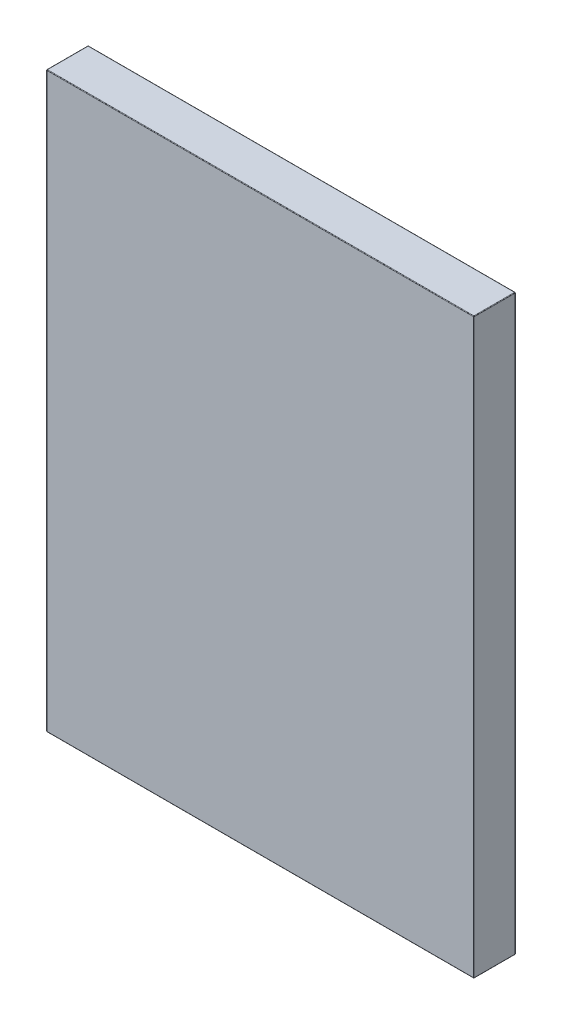
ISO-10303-21;
HEADER;
FILE_DESCRIPTION(('STEP AP214'),'2;1');
FILE_NAME('part.step','',(''),(''),'','','');
FILE_SCHEMA(('AUTOMOTIVE_DESIGN { 1 0 10303 214 1 1 1 1 }'));
ENDSEC;
DATA;
#1=APPLICATION_CONTEXT('core data for automotive mechanical design processes');
#2=APPLICATION_PROTOCOL_DEFINITION('international standard','automotive_design',2000,#1);
#3=PRODUCT_CONTEXT('',#1,'mechanical');
#4=PRODUCT('Part','Part','',(#3));
#5=PRODUCT_RELATED_PRODUCT_CATEGORY('part','',(#4));
#6=PRODUCT_DEFINITION_FORMATION('','',#4);
#7=PRODUCT_DEFINITION_CONTEXT('part definition',#1,'design');
#8=PRODUCT_DEFINITION('design','',#6,#7);
#9=PRODUCT_DEFINITION_SHAPE('','',#8);
#10=(LENGTH_UNIT() NAMED_UNIT(*) SI_UNIT(.MILLI.,.METRE.));
#11=(NAMED_UNIT(*) PLANE_ANGLE_UNIT() SI_UNIT($,.RADIAN.));
#12=(NAMED_UNIT(*) SI_UNIT($,.STERADIAN.) SOLID_ANGLE_UNIT());
#13=UNCERTAINTY_MEASURE_WITH_UNIT(LENGTH_MEASURE(1.E-05),#10,'distance_accuracy_value','');
#14=(GEOMETRIC_REPRESENTATION_CONTEXT(3) GLOBAL_UNCERTAINTY_ASSIGNED_CONTEXT((#13)) GLOBAL_UNIT_ASSIGNED_CONTEXT((#10,
#11,#12)) REPRESENTATION_CONTEXT('',''));
#15=CARTESIAN_POINT('',(0.,0.,0.));
#16=DIRECTION('',(0.,0.,1.));
#17=DIRECTION('',(1.,0.,0.));
#18=AXIS2_PLACEMENT_3D('',#15,#16,#17);
#19=CARTESIAN_POINT('',(410.,550.,80.));
#20=DIRECTION('',(-1.,0.,0.));
#21=DIRECTION('',(0.,-1.,0.));
#22=AXIS2_PLACEMENT_3D('',#19,#20,#21);
#23=PLANE('',#22);
#24=DIRECTION('',(0.,1.,0.));
#25=VECTOR('',#24,1.);
#26=CARTESIAN_POINT('',(410.,-550.,79.));
#27=LINE('',#26,#25);
#28=CARTESIAN_POINT('',(410.,549.,79.));
#29=VERTEX_POINT('',#28);
#30=CARTESIAN_POINT('',(410.,-549.,79.));
#31=VERTEX_POINT('',#30);
#32=EDGE_CURVE('E179',#29,#31,#27,.F.);
#33=ORIENTED_EDGE('',*,*,#32,.T.);
#34=DIRECTION('',(0.,0.,-1.));
#35=VECTOR('',#34,1.);
#36=CARTESIAN_POINT('',(410.,-549.,80.));
#37=LINE('',#36,#35);
#38=CARTESIAN_POINT('',(410.,-549.,1.));
#39=VERTEX_POINT('',#38);
#40=EDGE_CURVE('E183',#31,#39,#37,.T.);
#41=ORIENTED_EDGE('',*,*,#40,.T.);
#42=DIRECTION('',(0.,1.,0.));
#43=VECTOR('',#42,1.);
#44=CARTESIAN_POINT('',(410.,550.,1.));
#45=LINE('',#44,#43);
#46=CARTESIAN_POINT('',(410.,549.,1.));
#47=VERTEX_POINT('',#46);
#48=EDGE_CURVE('E164',#39,#47,#45,.T.);
#49=ORIENTED_EDGE('',*,*,#48,.T.);
#50=DIRECTION('',(0.,0.,-1.));
#51=VECTOR('',#50,1.);
#52=CARTESIAN_POINT('',(410.,549.,80.));
#53=LINE('',#52,#51);
#54=EDGE_CURVE('E181',#47,#29,#53,.F.);
#55=ORIENTED_EDGE('',*,*,#54,.T.);
#56=EDGE_LOOP('',(#33,#41,#49,#55));
#57=FACE_BOUND('',#56,.T.);
#58=ADVANCED_FACE('F35',(#57),#23,.F.);
#59=CARTESIAN_POINT('',(-410.,550.,80.));
#60=DIRECTION('',(0.,-1.,0.));
#61=DIRECTION('',(0.,0.,-1.));
#62=AXIS2_PLACEMENT_3D('',#59,#60,#61);
#63=PLANE('',#62);
#64=DIRECTION('',(-1.,0.,0.));
#65=VECTOR('',#64,1.);
#66=CARTESIAN_POINT('',(-410.,550.,1.));
#67=LINE('',#66,#65);
#68=CARTESIAN_POINT('',(409.,550.,1.));
#69=VERTEX_POINT('',#68);
#70=CARTESIAN_POINT('',(-409.,550.,1.));
#71=VERTEX_POINT('',#70);
#72=EDGE_CURVE('E132',#69,#71,#67,.T.);
#73=ORIENTED_EDGE('',*,*,#72,.T.);
#74=DIRECTION('',(0.,0.,-1.));
#75=VECTOR('',#74,1.);
#76=CARTESIAN_POINT('',(-409.,550.,80.));
#77=LINE('',#76,#75);
#78=CARTESIAN_POINT('',(-409.,550.,79.));
#79=VERTEX_POINT('',#78);
#80=EDGE_CURVE('E201',#71,#79,#77,.F.);
#81=ORIENTED_EDGE('',*,*,#80,.T.);
#82=DIRECTION('',(-1.,0.,0.));
#83=VECTOR('',#82,1.);
#84=CARTESIAN_POINT('',(410.,550.,79.));
#85=LINE('',#84,#83);
#86=CARTESIAN_POINT('',(409.,550.,79.));
#87=VERTEX_POINT('',#86);
#88=EDGE_CURVE('E197',#79,#87,#85,.F.);
#89=ORIENTED_EDGE('',*,*,#88,.T.);
#90=DIRECTION('',(0.,0.,-1.));
#91=VECTOR('',#90,1.);
#92=CARTESIAN_POINT('',(409.,550.,80.));
#93=LINE('',#92,#91);
#94=EDGE_CURVE('E199',#87,#69,#93,.T.);
#95=ORIENTED_EDGE('',*,*,#94,.T.);
#96=EDGE_LOOP('',(#73,#81,#89,#95));
#97=FACE_BOUND('',#96,.T.);
#98=ADVANCED_FACE('F302',(#97),#63,.F.);
#99=CARTESIAN_POINT('',(-410.,550.,80.));
#100=DIRECTION('',(1.,0.,0.));
#101=DIRECTION('',(0.,1.,0.));
#102=AXIS2_PLACEMENT_3D('',#99,#100,#101);
#103=PLANE('',#102);
#104=DIRECTION('',(0.,-1.,0.));
#105=VECTOR('',#104,1.);
#106=CARTESIAN_POINT('',(-410.,550.,1.));
#107=LINE('',#106,#105);
#108=CARTESIAN_POINT('',(-410.,549.,1.));
#109=VERTEX_POINT('',#108);
#110=CARTESIAN_POINT('',(-410.,-549.,1.));
#111=VERTEX_POINT('',#110);
#112=EDGE_CURVE('E159',#109,#111,#107,.T.);
#113=ORIENTED_EDGE('',*,*,#112,.T.);
#114=DIRECTION('',(0.,0.,-1.));
#115=VECTOR('',#114,1.);
#116=CARTESIAN_POINT('',(-410.,-549.,80.));
#117=LINE('',#116,#115);
#118=CARTESIAN_POINT('',(-410.,-549.,79.));
#119=VERTEX_POINT('',#118);
#120=EDGE_CURVE('E195',#111,#119,#117,.F.);
#121=ORIENTED_EDGE('',*,*,#120,.T.);
#122=DIRECTION('',(0.,-1.,0.));
#123=VECTOR('',#122,1.);
#124=CARTESIAN_POINT('',(-410.,550.,79.));
#125=LINE('',#124,#123);
#126=CARTESIAN_POINT('',(-410.,549.,79.));
#127=VERTEX_POINT('',#126);
#128=EDGE_CURVE('E191',#119,#127,#125,.F.);
#129=ORIENTED_EDGE('',*,*,#128,.T.);
#130=DIRECTION('',(0.,0.,-1.));
#131=VECTOR('',#130,1.);
#132=CARTESIAN_POINT('',(-410.,549.,80.));
#133=LINE('',#132,#131);
#134=EDGE_CURVE('E193',#127,#109,#133,.T.);
#135=ORIENTED_EDGE('',*,*,#134,.T.);
#136=EDGE_LOOP('',(#113,#121,#129,#135));
#137=FACE_BOUND('',#136,.T.);
#138=ADVANCED_FACE('F292',(#137),#103,.F.);
#139=CARTESIAN_POINT('',(-410.,-550.,80.));
#140=DIRECTION('',(0.,1.,0.));
#141=DIRECTION('',(0.,0.,1.));
#142=AXIS2_PLACEMENT_3D('',#139,#140,#141);
#143=PLANE('',#142);
#144=DIRECTION('',(1.,0.,0.));
#145=VECTOR('',#144,1.);
#146=CARTESIAN_POINT('',(-410.,-550.,1.));
#147=LINE('',#146,#145);
#148=CARTESIAN_POINT('',(-409.,-550.,1.));
#149=VERTEX_POINT('',#148);
#150=CARTESIAN_POINT('',(409.,-550.,1.));
#151=VERTEX_POINT('',#150);
#152=EDGE_CURVE('E168',#149,#151,#147,.T.);
#153=ORIENTED_EDGE('',*,*,#152,.T.);
#154=DIRECTION('',(0.,0.,-1.));
#155=VECTOR('',#154,1.);
#156=CARTESIAN_POINT('',(409.,-550.,80.));
#157=LINE('',#156,#155);
#158=CARTESIAN_POINT('',(409.,-550.,79.));
#159=VERTEX_POINT('',#158);
#160=EDGE_CURVE('E189',#151,#159,#157,.F.);
#161=ORIENTED_EDGE('',*,*,#160,.T.);
#162=DIRECTION('',(1.,0.,0.));
#163=VECTOR('',#162,1.);
#164=CARTESIAN_POINT('',(-410.,-550.,79.));
#165=LINE('',#164,#163);
#166=CARTESIAN_POINT('',(-409.,-550.,79.));
#167=VERTEX_POINT('',#166);
#168=EDGE_CURVE('E185',#159,#167,#165,.F.);
#169=ORIENTED_EDGE('',*,*,#168,.T.);
#170=DIRECTION('',(0.,0.,-1.));
#171=VECTOR('',#170,1.);
#172=CARTESIAN_POINT('',(-409.,-550.,80.));
#173=LINE('',#172,#171);
#174=EDGE_CURVE('E187',#167,#149,#173,.T.);
#175=ORIENTED_EDGE('',*,*,#174,.T.);
#176=EDGE_LOOP('',(#153,#161,#169,#175));
#177=FACE_BOUND('',#176,.T.);
#178=ADVANCED_FACE('F265',(#177),#143,.F.);
#179=CARTESIAN_POINT('',(0.,0.,80.));
#180=DIRECTION('',(0.,0.,1.));
#181=DIRECTION('',(1.,0.,0.));
#182=AXIS2_PLACEMENT_3D('',#179,#180,#181);
#183=PLANE('',#182);
#184=DIRECTION('',(0.,-1.,0.));
#185=VECTOR('',#184,1.);
#186=CARTESIAN_POINT('',(-409.,-550.,80.));
#187=LINE('',#186,#185);
#188=CARTESIAN_POINT('',(-409.,549.,80.));
#189=VERTEX_POINT('',#188);
#190=CARTESIAN_POINT('',(-409.,-549.,80.));
#191=VERTEX_POINT('',#190);
#192=EDGE_CURVE('E44',#189,#191,#187,.T.);
#193=ORIENTED_EDGE('',*,*,#192,.T.);
#194=DIRECTION('',(1.,0.,0.));
#195=VECTOR('',#194,1.);
#196=CARTESIAN_POINT('',(410.,-549.,80.));
#197=LINE('',#196,#195);
#198=CARTESIAN_POINT('',(409.,-549.,80.));
#199=VERTEX_POINT('',#198);
#200=EDGE_CURVE('E11',#191,#199,#197,.T.);
#201=ORIENTED_EDGE('',*,*,#200,.T.);
#202=DIRECTION('',(0.,1.,0.));
#203=VECTOR('',#202,1.);
#204=CARTESIAN_POINT('',(409.,550.,80.));
#205=LINE('',#204,#203);
#206=CARTESIAN_POINT('',(409.,549.,80.));
#207=VERTEX_POINT('',#206);
#208=EDGE_CURVE('E203',#199,#207,#205,.T.);
#209=ORIENTED_EDGE('',*,*,#208,.T.);
#210=DIRECTION('',(-1.,0.,0.));
#211=VECTOR('',#210,1.);
#212=CARTESIAN_POINT('',(-410.,549.,80.));
#213=LINE('',#212,#211);
#214=EDGE_CURVE('E55',#207,#189,#213,.T.);
#215=ORIENTED_EDGE('',*,*,#214,.T.);
#216=EDGE_LOOP('',(#193,#201,#209,#215));
#217=FACE_BOUND('',#216,.T.);
#218=ADVANCED_FACE('F491',(#217),#183,.T.);
#219=CARTESIAN_POINT('',(0.,0.,0.));
#220=DIRECTION('',(0.,0.,1.));
#221=DIRECTION('',(1.,0.,0.));
#222=AXIS2_PLACEMENT_3D('',#219,#220,#221);
#223=PLANE('',#222);
#224=DIRECTION('',(0.,-1.,0.));
#225=VECTOR('',#224,1.);
#226=CARTESIAN_POINT('',(-409.,0.,0.));
#227=LINE('',#226,#225);
#228=CARTESIAN_POINT('',(-409.,-549.,0.));
#229=VERTEX_POINT('',#228);
#230=CARTESIAN_POINT('',(-409.,549.,0.));
#231=VERTEX_POINT('',#230);
#232=EDGE_CURVE('E158',#229,#231,#227,.F.);
#233=ORIENTED_EDGE('',*,*,#232,.T.);
#234=DIRECTION('',(-1.,0.,0.));
#235=VECTOR('',#234,1.);
#236=CARTESIAN_POINT('',(0.,549.,0.));
#237=LINE('',#236,#235);
#238=CARTESIAN_POINT('',(409.,549.,0.));
#239=VERTEX_POINT('',#238);
#240=EDGE_CURVE('E129',#231,#239,#237,.F.);
#241=ORIENTED_EDGE('',*,*,#240,.T.);
#242=DIRECTION('',(0.,1.,0.));
#243=VECTOR('',#242,1.);
#244=CARTESIAN_POINT('',(409.,0.,0.));
#245=LINE('',#244,#243);
#246=CARTESIAN_POINT('',(409.,-549.,0.));
#247=VERTEX_POINT('',#246);
#248=EDGE_CURVE('E143',#239,#247,#245,.F.);
#249=ORIENTED_EDGE('',*,*,#248,.T.);
#250=DIRECTION('',(1.,0.,0.));
#251=VECTOR('',#250,1.);
#252=CARTESIAN_POINT('',(0.,-549.,0.));
#253=LINE('',#252,#251);
#254=EDGE_CURVE('E153',#247,#229,#253,.F.);
#255=ORIENTED_EDGE('',*,*,#254,.T.);
#256=EDGE_LOOP('',(#233,#241,#249,#255));
#257=FACE_BOUND('',#256,.T.);
#258=ADVANCED_FACE('F156',(#257),#223,.F.);
#259=CARTESIAN_POINT('',(-410.,-549.,1.));
#260=DIRECTION('',(1.,0.,0.));
#261=DIRECTION('',(0.,0.,-1.));
#262=AXIS2_PLACEMENT_3D('',#259,#260,#261);
#263=CYLINDRICAL_SURFACE('',#262,1.);
#264=ORIENTED_EDGE('',*,*,#254,.F.);
#265=CARTESIAN_POINT('',(409.,-549.,1.));
#266=DIRECTION('',(1.,0.,0.));
#267=DIRECTION('',(0.,0.,-1.));
#268=AXIS2_PLACEMENT_3D('',#265,#266,#267);
#269=CIRCLE('',#268,1.);
#270=EDGE_CURVE('E173',#247,#151,#269,.F.);
#271=ORIENTED_EDGE('',*,*,#270,.T.);
#272=ORIENTED_EDGE('',*,*,#152,.F.);
#273=CARTESIAN_POINT('',(-409.,-549.,1.));
#274=DIRECTION('',(1.,0.,0.));
#275=DIRECTION('',(0.,0.,-1.));
#276=AXIS2_PLACEMENT_3D('',#273,#274,#275);
#277=CIRCLE('',#276,1.);
#278=EDGE_CURVE('E166',#149,#229,#277,.T.);
#279=ORIENTED_EDGE('',*,*,#278,.T.);
#280=EDGE_LOOP('',(#264,#271,#272,#279));
#281=FACE_BOUND('',#280,.T.);
#282=ADVANCED_FACE('F277',(#281),#263,.T.);
#283=CARTESIAN_POINT('',(409.,550.,1.));
#284=DIRECTION('',(0.,1.,0.));
#285=DIRECTION('',(-1.,0.,0.));
#286=AXIS2_PLACEMENT_3D('',#283,#284,#285);
#287=CYLINDRICAL_SURFACE('',#286,1.);
#288=ORIENTED_EDGE('',*,*,#48,.F.);
#289=CARTESIAN_POINT('',(409.,-549.,1.));
#290=DIRECTION('',(0.,1.,0.));
#291=DIRECTION('',(-1.,0.,0.));
#292=AXIS2_PLACEMENT_3D('',#289,#290,#291);
#293=CIRCLE('',#292,1.);
#294=EDGE_CURVE('E149',#39,#247,#293,.T.);
#295=ORIENTED_EDGE('',*,*,#294,.T.);
#296=ORIENTED_EDGE('',*,*,#248,.F.);
#297=CARTESIAN_POINT('',(409.,549.,1.));
#298=DIRECTION('',(0.,1.,0.));
#299=DIRECTION('',(-1.,0.,0.));
#300=AXIS2_PLACEMENT_3D('',#297,#298,#299);
#301=CIRCLE('',#300,1.);
#302=EDGE_CURVE('E146',#239,#47,#301,.F.);
#303=ORIENTED_EDGE('',*,*,#302,.T.);
#304=EDGE_LOOP('',(#288,#295,#296,#303));
#305=FACE_BOUND('',#304,.T.);
#306=ADVANCED_FACE('F145',(#305),#287,.T.);
#307=CARTESIAN_POINT('',(-409.,550.,1.));
#308=DIRECTION('',(0.,-1.,0.));
#309=DIRECTION('',(1.,0.,0.));
#310=AXIS2_PLACEMENT_3D('',#307,#308,#309);
#311=CYLINDRICAL_SURFACE('',#310,1.);
#312=ORIENTED_EDGE('',*,*,#232,.F.);
#313=CARTESIAN_POINT('',(-409.,-549.,1.));
#314=DIRECTION('',(0.,-1.,0.));
#315=DIRECTION('',(1.,0.,0.));
#316=AXIS2_PLACEMENT_3D('',#313,#314,#315);
#317=CIRCLE('',#316,1.);
#318=EDGE_CURVE('E138',#229,#111,#317,.F.);
#319=ORIENTED_EDGE('',*,*,#318,.T.);
#320=ORIENTED_EDGE('',*,*,#112,.F.);
#321=CARTESIAN_POINT('',(-409.,549.,1.));
#322=DIRECTION('',(0.,-1.,0.));
#323=DIRECTION('',(1.,0.,0.));
#324=AXIS2_PLACEMENT_3D('',#321,#322,#323);
#325=CIRCLE('',#324,1.);
#326=EDGE_CURVE('E175',#109,#231,#325,.T.);
#327=ORIENTED_EDGE('',*,*,#326,.T.);
#328=EDGE_LOOP('',(#312,#319,#320,#327));
#329=FACE_BOUND('',#328,.T.);
#330=ADVANCED_FACE('F280',(#329),#311,.T.);
#331=CARTESIAN_POINT('',(-410.,549.,1.));
#332=DIRECTION('',(-1.,0.,0.));
#333=DIRECTION('',(0.,0.,1.));
#334=AXIS2_PLACEMENT_3D('',#331,#332,#333);
#335=CYLINDRICAL_SURFACE('',#334,1.);
#336=ORIENTED_EDGE('',*,*,#240,.F.);
#337=CARTESIAN_POINT('',(-409.,549.,1.));
#338=DIRECTION('',(-1.,0.,0.));
#339=DIRECTION('',(0.,0.,1.));
#340=AXIS2_PLACEMENT_3D('',#337,#338,#339);
#341=CIRCLE('',#340,1.);
#342=EDGE_CURVE('E137',#231,#71,#341,.F.);
#343=ORIENTED_EDGE('',*,*,#342,.T.);
#344=ORIENTED_EDGE('',*,*,#72,.F.);
#345=CARTESIAN_POINT('',(409.,549.,1.));
#346=DIRECTION('',(-1.,0.,0.));
#347=DIRECTION('',(0.,0.,1.));
#348=AXIS2_PLACEMENT_3D('',#345,#346,#347);
#349=CIRCLE('',#348,1.);
#350=EDGE_CURVE('E125',#69,#239,#349,.T.);
#351=ORIENTED_EDGE('',*,*,#350,.T.);
#352=EDGE_LOOP('',(#336,#343,#344,#351));
#353=FACE_BOUND('',#352,.T.);
#354=ADVANCED_FACE('F127',(#353),#335,.T.);
#355=CARTESIAN_POINT('',(-409.,549.,1.));
#356=DIRECTION('',(0.,0.,1.));
#357=DIRECTION('',(1.,0.,0.));
#358=AXIS2_PLACEMENT_3D('',#355,#356,#357);
#359=SPHERICAL_SURFACE('',#358,1.);
#360=ORIENTED_EDGE('',*,*,#342,.F.);
#361=ORIENTED_EDGE('',*,*,#326,.F.);
#362=CARTESIAN_POINT('',(-409.,549.,1.));
#363=DIRECTION('',(0.,0.,1.));
#364=DIRECTION('',(1.,0.,0.));
#365=AXIS2_PLACEMENT_3D('',#362,#363,#364);
#366=CIRCLE('',#365,1.);
#367=EDGE_CURVE('E39',#71,#109,#366,.T.);
#368=ORIENTED_EDGE('',*,*,#367,.F.);
#369=EDGE_LOOP('',(#360,#361,#368));
#370=FACE_BOUND('',#369,.T.);
#371=ADVANCED_FACE('F37',(#370),#359,.T.);
#372=CARTESIAN_POINT('',(-409.,549.,80.));
#373=DIRECTION('',(0.,0.,-1.));
#374=DIRECTION('',(-1.,0.,0.));
#375=AXIS2_PLACEMENT_3D('',#372,#373,#374);
#376=CYLINDRICAL_SURFACE('',#375,1.);
#377=ORIENTED_EDGE('',*,*,#367,.T.);
#378=ORIENTED_EDGE('',*,*,#134,.F.);
#379=CARTESIAN_POINT('',(-409.,549.,79.));
#380=DIRECTION('',(0.,0.,1.));
#381=DIRECTION('',(1.,0.,0.));
#382=AXIS2_PLACEMENT_3D('',#379,#380,#381);
#383=CIRCLE('',#382,1.);
#384=EDGE_CURVE('E244',#79,#127,#383,.T.);
#385=ORIENTED_EDGE('',*,*,#384,.F.);
#386=ORIENTED_EDGE('',*,*,#80,.F.);
#387=EDGE_LOOP('',(#377,#378,#385,#386));
#388=FACE_BOUND('',#387,.T.);
#389=ADVANCED_FACE('F448',(#388),#376,.T.);
#390=CARTESIAN_POINT('',(-409.,-549.,1.));
#391=DIRECTION('',(0.,0.,1.));
#392=DIRECTION('',(1.,0.,0.));
#393=AXIS2_PLACEMENT_3D('',#390,#391,#392);
#394=SPHERICAL_SURFACE('',#393,1.);
#395=ORIENTED_EDGE('',*,*,#318,.F.);
#396=ORIENTED_EDGE('',*,*,#278,.F.);
#397=CARTESIAN_POINT('',(-409.,-549.,1.));
#398=DIRECTION('',(0.,0.,1.));
#399=DIRECTION('',(1.,0.,0.));
#400=AXIS2_PLACEMENT_3D('',#397,#398,#399);
#401=CIRCLE('',#400,1.);
#402=EDGE_CURVE('E242',#111,#149,#401,.T.);
#403=ORIENTED_EDGE('',*,*,#402,.F.);
#404=EDGE_LOOP('',(#395,#396,#403));
#405=FACE_BOUND('',#404,.T.);
#406=ADVANCED_FACE('F285',(#405),#394,.T.);
#407=CARTESIAN_POINT('',(-409.,549.,79.));
#408=DIRECTION('',(0.,0.,1.));
#409=DIRECTION('',(1.,0.,0.));
#410=AXIS2_PLACEMENT_3D('',#407,#408,#409);
#411=SPHERICAL_SURFACE('',#410,1.);
#412=CARTESIAN_POINT('',(-409.,549.,79.));
#413=DIRECTION('',(-1.,0.,0.));
#414=DIRECTION('',(0.,0.,1.));
#415=AXIS2_PLACEMENT_3D('',#412,#413,#414);
#416=CIRCLE('',#415,1.);
#417=EDGE_CURVE('E237',#79,#189,#416,.F.);
#418=ORIENTED_EDGE('',*,*,#417,.F.);
#419=ORIENTED_EDGE('',*,*,#384,.T.);
#420=CARTESIAN_POINT('',(-409.,549.,79.));
#421=DIRECTION('',(0.,1.,0.));
#422=DIRECTION('',(0.,0.,1.));
#423=AXIS2_PLACEMENT_3D('',#420,#421,#422);
#424=CIRCLE('',#423,1.);
#425=EDGE_CURVE('E239',#189,#127,#424,.F.);
#426=ORIENTED_EDGE('',*,*,#425,.F.);
#427=EDGE_LOOP('',(#418,#419,#426));
#428=FACE_BOUND('',#427,.T.);
#429=ADVANCED_FACE('F296',(#428),#411,.T.);
#430=CARTESIAN_POINT('',(409.,549.,1.));
#431=DIRECTION('',(0.,0.,1.));
#432=DIRECTION('',(1.,0.,0.));
#433=AXIS2_PLACEMENT_3D('',#430,#431,#432);
#434=SPHERICAL_SURFACE('',#433,1.);
#435=ORIENTED_EDGE('',*,*,#302,.F.);
#436=ORIENTED_EDGE('',*,*,#350,.F.);
#437=CARTESIAN_POINT('',(409.,549.,1.));
#438=DIRECTION('',(0.,0.,1.));
#439=DIRECTION('',(1.,0.,0.));
#440=AXIS2_PLACEMENT_3D('',#437,#438,#439);
#441=CIRCLE('',#440,1.);
#442=EDGE_CURVE('E162',#47,#69,#441,.T.);
#443=ORIENTED_EDGE('',*,*,#442,.F.);
#444=EDGE_LOOP('',(#435,#436,#443));
#445=FACE_BOUND('',#444,.T.);
#446=ADVANCED_FACE('F161',(#445),#434,.T.);
#447=CARTESIAN_POINT('',(-409.,-549.,80.));
#448=DIRECTION('',(0.,0.,-1.));
#449=DIRECTION('',(-1.,0.,0.));
#450=AXIS2_PLACEMENT_3D('',#447,#448,#449);
#451=CYLINDRICAL_SURFACE('',#450,1.);
#452=ORIENTED_EDGE('',*,*,#402,.T.);
#453=ORIENTED_EDGE('',*,*,#174,.F.);
#454=CARTESIAN_POINT('',(-409.,-549.,79.));
#455=DIRECTION('',(0.,0.,1.));
#456=DIRECTION('',(1.,0.,0.));
#457=AXIS2_PLACEMENT_3D('',#454,#455,#456);
#458=CIRCLE('',#457,1.);
#459=EDGE_CURVE('E233',#119,#167,#458,.T.);
#460=ORIENTED_EDGE('',*,*,#459,.F.);
#461=ORIENTED_EDGE('',*,*,#120,.F.);
#462=EDGE_LOOP('',(#452,#453,#460,#461));
#463=FACE_BOUND('',#462,.T.);
#464=ADVANCED_FACE('F289',(#463),#451,.T.);
#465=CARTESIAN_POINT('',(-409.,0.,79.));
#466=DIRECTION('',(0.,1.,0.));
#467=DIRECTION('',(-1.,0.,0.));
#468=AXIS2_PLACEMENT_3D('',#465,#466,#467);
#469=CYLINDRICAL_SURFACE('',#468,1.);
#470=ORIENTED_EDGE('',*,*,#425,.T.);
#471=ORIENTED_EDGE('',*,*,#128,.F.);
#472=CARTESIAN_POINT('',(-409.,-549.,79.));
#473=DIRECTION('',(0.,-1.,0.));
#474=DIRECTION('',(0.,0.,-1.));
#475=AXIS2_PLACEMENT_3D('',#472,#473,#474);
#476=CIRCLE('',#475,1.);
#477=EDGE_CURVE('E230',#191,#119,#476,.T.);
#478=ORIENTED_EDGE('',*,*,#477,.F.);
#479=ORIENTED_EDGE('',*,*,#192,.F.);
#480=EDGE_LOOP('',(#470,#471,#478,#479));
#481=FACE_BOUND('',#480,.T.);
#482=ADVANCED_FACE('F294',(#481),#469,.T.);
#483=CARTESIAN_POINT('',(0.,549.,79.));
#484=DIRECTION('',(1.,0.,0.));
#485=DIRECTION('',(0.,0.,-1.));
#486=AXIS2_PLACEMENT_3D('',#483,#484,#485);
#487=CYLINDRICAL_SURFACE('',#486,1.);
#488=ORIENTED_EDGE('',*,*,#417,.T.);
#489=ORIENTED_EDGE('',*,*,#214,.F.);
#490=CARTESIAN_POINT('',(409.,549.,79.));
#491=DIRECTION('',(1.,0.,0.));
#492=DIRECTION('',(0.,0.,-1.));
#493=AXIS2_PLACEMENT_3D('',#490,#491,#492);
#494=CIRCLE('',#493,1.);
#495=EDGE_CURVE('E227',#87,#207,#494,.T.);
#496=ORIENTED_EDGE('',*,*,#495,.F.);
#497=ORIENTED_EDGE('',*,*,#88,.F.);
#498=EDGE_LOOP('',(#488,#489,#496,#497));
#499=FACE_BOUND('',#498,.T.);
#500=ADVANCED_FACE('F300',(#499),#487,.T.);
#501=CARTESIAN_POINT('',(409.,549.,80.));
#502=DIRECTION('',(0.,0.,-1.));
#503=DIRECTION('',(-1.,0.,0.));
#504=AXIS2_PLACEMENT_3D('',#501,#502,#503);
#505=CYLINDRICAL_SURFACE('',#504,1.);
#506=ORIENTED_EDGE('',*,*,#442,.T.);
#507=ORIENTED_EDGE('',*,*,#94,.F.);
#508=CARTESIAN_POINT('',(409.,549.,79.));
#509=DIRECTION('',(0.,0.,1.));
#510=DIRECTION('',(1.,0.,0.));
#511=AXIS2_PLACEMENT_3D('',#508,#509,#510);
#512=CIRCLE('',#511,1.);
#513=EDGE_CURVE('E224',#29,#87,#512,.T.);
#514=ORIENTED_EDGE('',*,*,#513,.F.);
#515=ORIENTED_EDGE('',*,*,#54,.F.);
#516=EDGE_LOOP('',(#506,#507,#514,#515));
#517=FACE_BOUND('',#516,.T.);
#518=ADVANCED_FACE('F305',(#517),#505,.T.);
#519=CARTESIAN_POINT('',(-409.,-549.,79.));
#520=DIRECTION('',(0.,0.,1.));
#521=DIRECTION('',(1.,0.,0.));
#522=AXIS2_PLACEMENT_3D('',#519,#520,#521);
#523=SPHERICAL_SURFACE('',#522,1.);
#524=ORIENTED_EDGE('',*,*,#477,.T.);
#525=ORIENTED_EDGE('',*,*,#459,.T.);
#526=CARTESIAN_POINT('',(-409.,-549.,79.));
#527=DIRECTION('',(-1.,0.,0.));
#528=DIRECTION('',(0.,0.,1.));
#529=AXIS2_PLACEMENT_3D('',#526,#527,#528);
#530=CIRCLE('',#529,1.);
#531=EDGE_CURVE('E221',#191,#167,#530,.F.);
#532=ORIENTED_EDGE('',*,*,#531,.F.);
#533=EDGE_LOOP('',(#524,#525,#532));
#534=FACE_BOUND('',#533,.T.);
#535=ADVANCED_FACE('F320',(#534),#523,.T.);
#536=CARTESIAN_POINT('',(409.,549.,79.));
#537=DIRECTION('',(0.,0.,1.));
#538=DIRECTION('',(1.,0.,0.));
#539=AXIS2_PLACEMENT_3D('',#536,#537,#538);
#540=SPHERICAL_SURFACE('',#539,1.);
#541=ORIENTED_EDGE('',*,*,#513,.T.);
#542=ORIENTED_EDGE('',*,*,#495,.T.);
#543=CARTESIAN_POINT('',(409.,549.,79.));
#544=DIRECTION('',(0.,1.,0.));
#545=DIRECTION('',(0.,0.,1.));
#546=AXIS2_PLACEMENT_3D('',#543,#544,#545);
#547=CIRCLE('',#546,1.);
#548=EDGE_CURVE('E218',#29,#207,#547,.F.);
#549=ORIENTED_EDGE('',*,*,#548,.F.);
#550=EDGE_LOOP('',(#541,#542,#549));
#551=FACE_BOUND('',#550,.T.);
#552=ADVANCED_FACE('F322',(#551),#540,.T.);
#553=CARTESIAN_POINT('',(0.,-549.,79.));
#554=DIRECTION('',(-1.,0.,0.));
#555=DIRECTION('',(0.,0.,1.));
#556=AXIS2_PLACEMENT_3D('',#553,#554,#555);
#557=CYLINDRICAL_SURFACE('',#556,1.);
#558=ORIENTED_EDGE('',*,*,#531,.T.);
#559=ORIENTED_EDGE('',*,*,#168,.F.);
#560=CARTESIAN_POINT('',(409.,-549.,79.));
#561=DIRECTION('',(1.,0.,0.));
#562=DIRECTION('',(0.,0.,-1.));
#563=AXIS2_PLACEMENT_3D('',#560,#561,#562);
#564=CIRCLE('',#563,1.);
#565=EDGE_CURVE('E215',#199,#159,#564,.T.);
#566=ORIENTED_EDGE('',*,*,#565,.F.);
#567=ORIENTED_EDGE('',*,*,#200,.F.);
#568=EDGE_LOOP('',(#558,#559,#566,#567));
#569=FACE_BOUND('',#568,.T.);
#570=ADVANCED_FACE('F318',(#569),#557,.T.);
#571=CARTESIAN_POINT('',(409.,0.,79.));
#572=DIRECTION('',(0.,-1.,0.));
#573=DIRECTION('',(1.,0.,0.));
#574=AXIS2_PLACEMENT_3D('',#571,#572,#573);
#575=CYLINDRICAL_SURFACE('',#574,1.);
#576=ORIENTED_EDGE('',*,*,#548,.T.);
#577=ORIENTED_EDGE('',*,*,#208,.F.);
#578=CARTESIAN_POINT('',(409.,-549.,79.));
#579=DIRECTION('',(0.,-1.,1.11022302462516E-13));
#580=DIRECTION('',(0.,-1.11022302462516E-13,-1.));
#581=AXIS2_PLACEMENT_3D('',#578,#579,#580);
#582=CIRCLE('',#581,1.);
#583=EDGE_CURVE('E213',#31,#199,#582,.T.);
#584=ORIENTED_EDGE('',*,*,#583,.F.);
#585=ORIENTED_EDGE('',*,*,#32,.F.);
#586=EDGE_LOOP('',(#576,#577,#584,#585));
#587=FACE_BOUND('',#586,.T.);
#588=ADVANCED_FACE('F312',(#587),#575,.T.);
#589=CARTESIAN_POINT('',(409.,-549.,79.));
#590=DIRECTION('',(0.,0.,1.));
#591=DIRECTION('',(1.,0.,0.));
#592=AXIS2_PLACEMENT_3D('',#589,#590,#591);
#593=SPHERICAL_SURFACE('',#592,1.);
#594=ORIENTED_EDGE('',*,*,#583,.T.);
#595=ORIENTED_EDGE('',*,*,#565,.T.);
#596=CARTESIAN_POINT('',(409.,-549.,79.));
#597=DIRECTION('',(0.,0.,1.));
#598=DIRECTION('',(1.,0.,0.));
#599=AXIS2_PLACEMENT_3D('',#596,#597,#598);
#600=CIRCLE('',#599,1.);
#601=EDGE_CURVE('E210',#31,#159,#600,.F.);
#602=ORIENTED_EDGE('',*,*,#601,.F.);
#603=EDGE_LOOP('',(#594,#595,#602));
#604=FACE_BOUND('',#603,.T.);
#605=ADVANCED_FACE('F315',(#604),#593,.T.);
#606=CARTESIAN_POINT('',(409.,-549.,80.));
#607=DIRECTION('',(0.,0.,-1.));
#608=DIRECTION('',(-1.,0.,0.));
#609=AXIS2_PLACEMENT_3D('',#606,#607,#608);
#610=CYLINDRICAL_SURFACE('',#609,1.);
#611=ORIENTED_EDGE('',*,*,#601,.T.);
#612=ORIENTED_EDGE('',*,*,#160,.F.);
#613=CARTESIAN_POINT('',(409.,-549.,1.));
#614=DIRECTION('',(0.,0.,-1.));
#615=DIRECTION('',(-1.,0.,0.));
#616=AXIS2_PLACEMENT_3D('',#613,#614,#615);
#617=CIRCLE('',#616,1.);
#618=EDGE_CURVE('E207',#39,#151,#617,.T.);
#619=ORIENTED_EDGE('',*,*,#618,.F.);
#620=ORIENTED_EDGE('',*,*,#40,.F.);
#621=EDGE_LOOP('',(#611,#612,#619,#620));
#622=FACE_BOUND('',#621,.T.);
#623=ADVANCED_FACE('F272',(#622),#610,.T.);
#624=CARTESIAN_POINT('',(409.,-549.,1.));
#625=DIRECTION('',(0.,0.,1.));
#626=DIRECTION('',(1.,0.,0.));
#627=AXIS2_PLACEMENT_3D('',#624,#625,#626);
#628=SPHERICAL_SURFACE('',#627,1.);
#629=ORIENTED_EDGE('',*,*,#618,.T.);
#630=ORIENTED_EDGE('',*,*,#270,.F.);
#631=ORIENTED_EDGE('',*,*,#294,.F.);
#632=EDGE_LOOP('',(#629,#630,#631));
#633=FACE_BOUND('',#632,.T.);
#634=ADVANCED_FACE('F276',(#633),#628,.T.);
#635=CLOSED_SHELL('',(#58,#98,#138,#178,#218,#258,#282,#306,#330,#354,#371,#389,#406,#429,#446,
#464,#482,#500,#518,#535,#552,#570,#588,#605,#623,#634));
#636=MANIFOLD_SOLID_BREP('B2',#635);
#637=ADVANCED_BREP_SHAPE_REPRESENTATION('',(#18,#636),#14);
#638=SHAPE_DEFINITION_REPRESENTATION(#9,#637);
ENDSEC;
END-ISO-10303-21;
